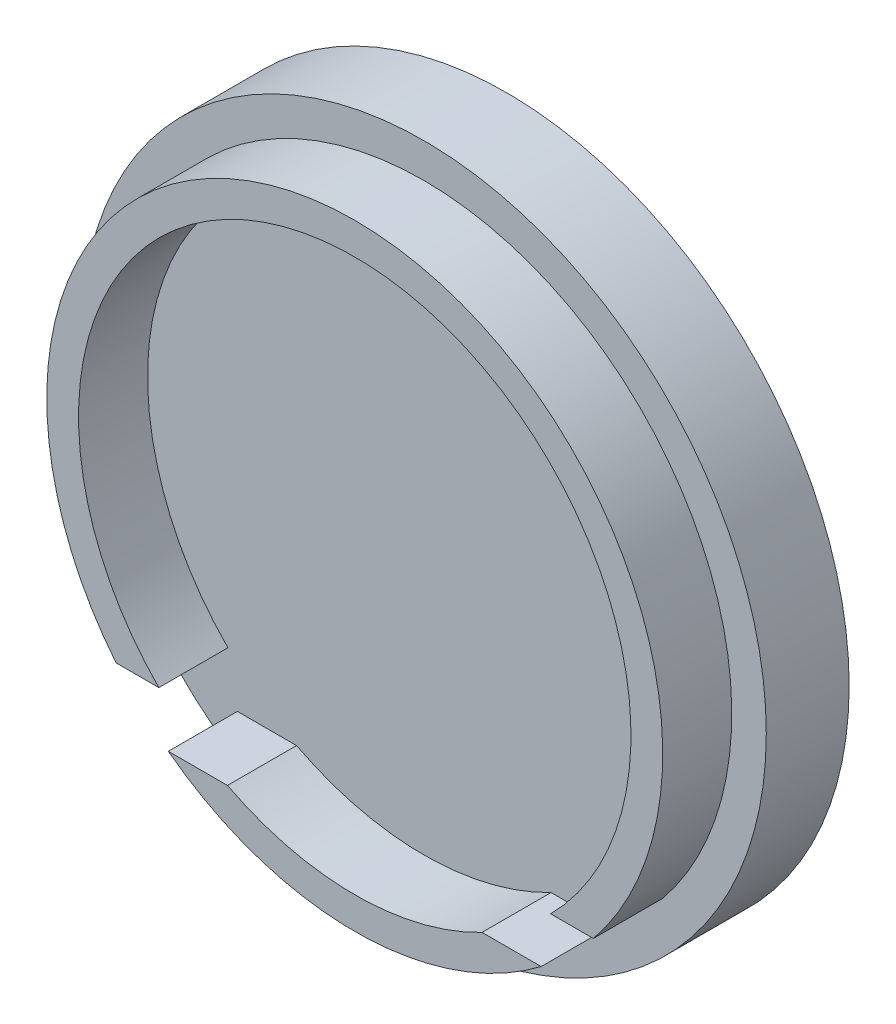
ISO-10303-21;
HEADER;
FILE_DESCRIPTION(('STEP AP214'),'2;1');
FILE_NAME('part.step','',(''),(''),'','','');
FILE_SCHEMA(('AUTOMOTIVE_DESIGN { 1 0 10303 214 1 1 1 1 }'));
ENDSEC;
DATA;
#1=APPLICATION_CONTEXT('core data for automotive mechanical design processes');
#2=APPLICATION_PROTOCOL_DEFINITION('international standard','automotive_design',2000,#1);
#3=PRODUCT_CONTEXT('',#1,'mechanical');
#4=PRODUCT('Part','Part','',(#3));
#5=PRODUCT_RELATED_PRODUCT_CATEGORY('part','',(#4));
#6=PRODUCT_DEFINITION_FORMATION('','',#4);
#7=PRODUCT_DEFINITION_CONTEXT('part definition',#1,'design');
#8=PRODUCT_DEFINITION('design','',#6,#7);
#9=PRODUCT_DEFINITION_SHAPE('','',#8);
#10=(LENGTH_UNIT() NAMED_UNIT(*) SI_UNIT(.MILLI.,.METRE.));
#11=(NAMED_UNIT(*) PLANE_ANGLE_UNIT() SI_UNIT($,.RADIAN.));
#12=(NAMED_UNIT(*) SI_UNIT($,.STERADIAN.) SOLID_ANGLE_UNIT());
#13=UNCERTAINTY_MEASURE_WITH_UNIT(LENGTH_MEASURE(1.E-05),#10,'distance_accuracy_value','');
#14=(GEOMETRIC_REPRESENTATION_CONTEXT(3) GLOBAL_UNCERTAINTY_ASSIGNED_CONTEXT((#13)) GLOBAL_UNIT_ASSIGNED_CONTEXT((#10,
#11,#12)) REPRESENTATION_CONTEXT('',''));
#15=CARTESIAN_POINT('',(0.,0.,0.));
#16=DIRECTION('',(0.,0.,1.));
#17=DIRECTION('',(1.,0.,0.));
#18=AXIS2_PLACEMENT_3D('',#15,#16,#17);
#19=CARTESIAN_POINT('',(0.,0.,11.));
#20=DIRECTION('',(0.,0.,1.));
#21=DIRECTION('',(1.,0.,0.));
#22=AXIS2_PLACEMENT_3D('',#19,#20,#21);
#23=PLANE('',#22);
#24=CARTESIAN_POINT('',(0.,0.,11.));
#25=DIRECTION('',(0.,0.,1.));
#26=DIRECTION('',(1.,0.,0.));
#27=AXIS2_PLACEMENT_3D('',#24,#25,#26);
#28=CIRCLE('',#27,20.);
#29=CARTESIAN_POINT('',(-9.21615429558338,-17.75,11.));
#30=VERTEX_POINT('',#29);
#31=CARTESIAN_POINT('',(9.21615429558338,-17.75,11.));
#32=VERTEX_POINT('',#31);
#33=EDGE_CURVE('E130',#30,#32,#28,.T.);
#34=ORIENTED_EDGE('',*,*,#33,.F.);
#35=DIRECTION('',(-1.,0.,0.));
#36=VECTOR('',#35,1.);
#37=CARTESIAN_POINT('',(0.,-17.75,11.));
#38=LINE('',#37,#36);
#39=CARTESIAN_POINT('',(-13.4991666409449,-17.75,11.));
#40=VERTEX_POINT('',#39);
#41=EDGE_CURVE('E145',#30,#40,#38,.T.);
#42=ORIENTED_EDGE('',*,*,#41,.T.);
#43=CARTESIAN_POINT('',(0.,0.,11.));
#44=DIRECTION('',(0.,0.,1.));
#45=DIRECTION('',(1.,0.,0.));
#46=AXIS2_PLACEMENT_3D('',#43,#44,#45);
#47=CIRCLE('',#46,22.3);
#48=CARTESIAN_POINT('',(13.4991666409449,-17.75,11.));
#49=VERTEX_POINT('',#48);
#50=EDGE_CURVE('E125',#40,#49,#47,.T.);
#51=ORIENTED_EDGE('',*,*,#50,.T.);
#52=DIRECTION('',(1.,0.,0.));
#53=VECTOR('',#52,1.);
#54=CARTESIAN_POINT('',(0.,-17.75,11.));
#55=LINE('',#54,#53);
#56=EDGE_CURVE('E150',#32,#49,#55,.T.);
#57=ORIENTED_EDGE('',*,*,#56,.F.);
#58=EDGE_LOOP('',(#34,#42,#51,#57));
#59=FACE_BOUND('',#58,.T.);
#60=ADVANCED_FACE('F33',(#59),#23,.T.);
#61=DIRECTION('',(-1.,0.,0.));
#62=VECTOR('',#61,1.);
#63=CARTESIAN_POINT('',(0.,-14.1,11.));
#64=LINE('',#63,#62);
#65=CARTESIAN_POINT('',(-14.184146079338,-14.1,11.));
#66=VERTEX_POINT('',#65);
#67=CARTESIAN_POINT('',(-17.2765737343954,-14.1,11.));
#68=VERTEX_POINT('',#67);
#69=EDGE_CURVE('E159',#66,#68,#64,.T.);
#70=ORIENTED_EDGE('',*,*,#69,.F.);
#71=CARTESIAN_POINT('',(14.184146079338,-14.1,11.));
#72=VERTEX_POINT('',#71);
#73=EDGE_CURVE('E115',#72,#66,#28,.T.);
#74=ORIENTED_EDGE('',*,*,#73,.F.);
#75=DIRECTION('',(1.,0.,0.));
#76=VECTOR('',#75,1.);
#77=CARTESIAN_POINT('',(0.,-14.1,11.));
#78=LINE('',#77,#76);
#79=CARTESIAN_POINT('',(17.2765737343954,-14.1,11.));
#80=VERTEX_POINT('',#79);
#81=EDGE_CURVE('E146',#72,#80,#78,.T.);
#82=ORIENTED_EDGE('',*,*,#81,.T.);
#83=EDGE_CURVE('E131',#80,#68,#47,.T.);
#84=ORIENTED_EDGE('',*,*,#83,.T.);
#85=EDGE_LOOP('',(#70,#74,#82,#84));
#86=FACE_BOUND('',#85,.T.);
#87=ADVANCED_FACE('F181',(#86),#23,.T.);
#88=CARTESIAN_POINT('',(0.,0.,11.));
#89=DIRECTION('',(0.,0.,-1.));
#90=DIRECTION('',(-1.,0.,0.));
#91=AXIS2_PLACEMENT_3D('',#88,#89,#90);
#92=CYLINDRICAL_SURFACE('',#91,22.3);
#93=DIRECTION('',(0.,0.,1.));
#94=VECTOR('',#93,1.);
#95=CARTESIAN_POINT('',(-13.4991666409449,-17.75,6.));
#96=LINE('',#95,#94);
#97=CARTESIAN_POINT('',(-13.4991666409449,-17.75,6.));
#98=VERTEX_POINT('',#97);
#99=EDGE_CURVE('E135',#98,#40,#96,.T.);
#100=ORIENTED_EDGE('',*,*,#99,.F.);
#101=CARTESIAN_POINT('',(0.,0.,6.));
#102=DIRECTION('',(0.,0.,1.));
#103=DIRECTION('',(1.,0.,0.));
#104=AXIS2_PLACEMENT_3D('',#101,#102,#103);
#105=CIRCLE('',#104,22.3);
#106=CARTESIAN_POINT('',(13.4991666409449,-17.75,6.));
#107=VERTEX_POINT('',#106);
#108=EDGE_CURVE('E129',#98,#107,#105,.T.);
#109=ORIENTED_EDGE('',*,*,#108,.T.);
#110=DIRECTION('',(0.,0.,1.));
#111=VECTOR('',#110,1.);
#112=CARTESIAN_POINT('',(13.4991666409449,-17.75,6.));
#113=LINE('',#112,#111);
#114=EDGE_CURVE('E138',#107,#49,#113,.T.);
#115=ORIENTED_EDGE('',*,*,#114,.T.);
#116=ORIENTED_EDGE('',*,*,#50,.F.);
#117=EDGE_LOOP('',(#100,#109,#115,#116));
#118=FACE_BOUND('',#117,.T.);
#119=ADVANCED_FACE('F169',(#118),#92,.T.);
#120=CARTESIAN_POINT('',(17.2765737343954,-14.1,6.));
#121=VERTEX_POINT('',#120);
#122=CARTESIAN_POINT('',(-17.2765737343954,-14.1,6.));
#123=VERTEX_POINT('',#122);
#124=EDGE_CURVE('E127',#121,#123,#105,.T.);
#125=ORIENTED_EDGE('',*,*,#124,.T.);
#126=DIRECTION('',(0.,0.,1.));
#127=VECTOR('',#126,1.);
#128=CARTESIAN_POINT('',(-17.2765737343954,-14.1,6.));
#129=LINE('',#128,#127);
#130=EDGE_CURVE('E105',#123,#68,#129,.T.);
#131=ORIENTED_EDGE('',*,*,#130,.T.);
#132=ORIENTED_EDGE('',*,*,#83,.F.);
#133=DIRECTION('',(0.,0.,1.));
#134=VECTOR('',#133,1.);
#135=CARTESIAN_POINT('',(17.2765737343954,-14.1,6.));
#136=LINE('',#135,#134);
#137=EDGE_CURVE('E141',#121,#80,#136,.T.);
#138=ORIENTED_EDGE('',*,*,#137,.F.);
#139=EDGE_LOOP('',(#125,#131,#132,#138));
#140=FACE_BOUND('',#139,.T.);
#141=ADVANCED_FACE('F193',(#140),#92,.T.);
#142=CARTESIAN_POINT('',(0.,0.,11.));
#143=DIRECTION('',(0.,0.,-1.));
#144=DIRECTION('',(-1.,0.,0.));
#145=AXIS2_PLACEMENT_3D('',#142,#143,#144);
#146=CYLINDRICAL_SURFACE('',#145,20.);
#147=CARTESIAN_POINT('',(0.,0.,6.));
#148=DIRECTION('',(0.,0.,1.));
#149=DIRECTION('',(1.,0.,0.));
#150=AXIS2_PLACEMENT_3D('',#147,#148,#149);
#151=CIRCLE('',#150,20.);
#152=CARTESIAN_POINT('',(9.21615429558338,-17.75,6.));
#153=VERTEX_POINT('',#152);
#154=CARTESIAN_POINT('',(-9.21615429558338,-17.75,6.));
#155=VERTEX_POINT('',#154);
#156=EDGE_CURVE('E11',#153,#155,#151,.F.);
#157=ORIENTED_EDGE('',*,*,#156,.T.);
#158=DIRECTION('',(0.,0.,1.));
#159=VECTOR('',#158,1.);
#160=CARTESIAN_POINT('',(-9.21615429558338,-17.75,6.));
#161=LINE('',#160,#159);
#162=EDGE_CURVE('E107',#155,#30,#161,.T.);
#163=ORIENTED_EDGE('',*,*,#162,.T.);
#164=ORIENTED_EDGE('',*,*,#33,.T.);
#165=DIRECTION('',(0.,0.,1.));
#166=VECTOR('',#165,1.);
#167=CARTESIAN_POINT('',(9.21615429558338,-17.75,6.));
#168=LINE('',#167,#166);
#169=EDGE_CURVE('E136',#153,#32,#168,.T.);
#170=ORIENTED_EDGE('',*,*,#169,.F.);
#171=EDGE_LOOP('',(#157,#163,#164,#170));
#172=FACE_BOUND('',#171,.T.);
#173=ADVANCED_FACE('F177',(#172),#146,.F.);
#174=DIRECTION('',(0.,0.,1.));
#175=VECTOR('',#174,1.);
#176=CARTESIAN_POINT('',(-14.184146079338,-14.1,6.));
#177=LINE('',#176,#175);
#178=CARTESIAN_POINT('',(-14.184146079338,-14.1,6.));
#179=VERTEX_POINT('',#178);
#180=EDGE_CURVE('E102',#179,#66,#177,.T.);
#181=ORIENTED_EDGE('',*,*,#180,.F.);
#182=CARTESIAN_POINT('',(14.184146079338,-14.1,6.));
#183=VERTEX_POINT('',#182);
#184=EDGE_CURVE('E37',#179,#183,#151,.F.);
#185=ORIENTED_EDGE('',*,*,#184,.T.);
#186=DIRECTION('',(0.,0.,1.));
#187=VECTOR('',#186,1.);
#188=CARTESIAN_POINT('',(14.184146079338,-14.1,6.));
#189=LINE('',#188,#187);
#190=EDGE_CURVE('E143',#183,#72,#189,.T.);
#191=ORIENTED_EDGE('',*,*,#190,.T.);
#192=ORIENTED_EDGE('',*,*,#73,.T.);
#193=EDGE_LOOP('',(#181,#185,#191,#192));
#194=FACE_BOUND('',#193,.T.);
#195=ADVANCED_FACE('F112',(#194),#146,.F.);
#196=CARTESIAN_POINT('',(0.,0.,6.));
#197=DIRECTION('',(0.,0.,-1.));
#198=DIRECTION('',(-1.,0.,0.));
#199=AXIS2_PLACEMENT_3D('',#196,#197,#198);
#200=CYLINDRICAL_SURFACE('',#199,24.8);
#201=CARTESIAN_POINT('',(0.,0.,6.));
#202=DIRECTION('',(0.,0.,1.));
#203=DIRECTION('',(1.,0.,0.));
#204=AXIS2_PLACEMENT_3D('',#201,#202,#203);
#205=CIRCLE('',#204,24.8);
#206=CARTESIAN_POINT('',(24.8,0.,6.));
#207=VERTEX_POINT('',#206);
#208=EDGE_CURVE('E119',#207,#207,#205,.T.);
#209=ORIENTED_EDGE('',*,*,#208,.F.);
#210=EDGE_LOOP('',(#209));
#211=FACE_BOUND('',#210,.T.);
#212=CARTESIAN_POINT('',(0.,0.,0.));
#213=DIRECTION('',(0.,0.,1.));
#214=DIRECTION('',(1.,0.,0.));
#215=AXIS2_PLACEMENT_3D('',#212,#213,#214);
#216=CIRCLE('',#215,24.8);
#217=CARTESIAN_POINT('',(24.8,0.,0.));
#218=VERTEX_POINT('',#217);
#219=EDGE_CURVE('E121',#218,#218,#216,.T.);
#220=ORIENTED_EDGE('',*,*,#219,.T.);
#221=EDGE_LOOP('',(#220));
#222=FACE_BOUND('',#221,.T.);
#223=ADVANCED_FACE('F35',(#211,#222),#200,.T.);
#224=CARTESIAN_POINT('',(0.,0.,6.));
#225=DIRECTION('',(0.,0.,1.));
#226=DIRECTION('',(1.,0.,0.));
#227=AXIS2_PLACEMENT_3D('',#224,#225,#226);
#228=PLANE('',#227);
#229=ORIENTED_EDGE('',*,*,#108,.F.);
#230=DIRECTION('',(-1.,0.,0.));
#231=VECTOR('',#230,1.);
#232=CARTESIAN_POINT('',(0.,-17.75,6.));
#233=LINE('',#232,#231);
#234=EDGE_CURVE('E48',#155,#98,#233,.T.);
#235=ORIENTED_EDGE('',*,*,#234,.F.);
#236=ORIENTED_EDGE('',*,*,#156,.F.);
#237=DIRECTION('',(1.,0.,0.));
#238=VECTOR('',#237,1.);
#239=CARTESIAN_POINT('',(0.,-17.75,6.));
#240=LINE('',#239,#238);
#241=EDGE_CURVE('E149',#153,#107,#240,.T.);
#242=ORIENTED_EDGE('',*,*,#241,.T.);
#243=EDGE_LOOP('',(#229,#235,#236,#242));
#244=FACE_BOUND('',#243,.T.);
#245=DIRECTION('',(-1.,0.,0.));
#246=VECTOR('',#245,1.);
#247=CARTESIAN_POINT('',(0.,-14.1,6.));
#248=LINE('',#247,#246);
#249=EDGE_CURVE('E99',#179,#123,#248,.T.);
#250=ORIENTED_EDGE('',*,*,#249,.T.);
#251=ORIENTED_EDGE('',*,*,#124,.F.);
#252=DIRECTION('',(1.,0.,0.));
#253=VECTOR('',#252,1.);
#254=CARTESIAN_POINT('',(0.,-14.1,6.));
#255=LINE('',#254,#253);
#256=EDGE_CURVE('E56',#183,#121,#255,.T.);
#257=ORIENTED_EDGE('',*,*,#256,.F.);
#258=ORIENTED_EDGE('',*,*,#184,.F.);
#259=EDGE_LOOP('',(#250,#251,#257,#258));
#260=FACE_BOUND('',#259,.T.);
#261=ORIENTED_EDGE('',*,*,#208,.T.);
#262=EDGE_LOOP('',(#261));
#263=FACE_BOUND('',#262,.T.);
#264=ADVANCED_FACE('F117',(#244,#260,#263),#228,.T.);
#265=CARTESIAN_POINT('',(0.,0.,0.));
#266=DIRECTION('',(0.,0.,1.));
#267=DIRECTION('',(1.,0.,0.));
#268=AXIS2_PLACEMENT_3D('',#265,#266,#267);
#269=PLANE('',#268);
#270=ORIENTED_EDGE('',*,*,#219,.F.);
#271=EDGE_LOOP('',(#270));
#272=FACE_BOUND('',#271,.T.);
#273=ADVANCED_FACE('F195',(#272),#269,.F.);
#274=CARTESIAN_POINT('',(0.,-14.1,6.));
#275=DIRECTION('',(0.,-1.,0.));
#276=DIRECTION('',(0.,0.,-1.));
#277=AXIS2_PLACEMENT_3D('',#274,#275,#276);
#278=PLANE('',#277);
#279=ORIENTED_EDGE('',*,*,#81,.F.);
#280=ORIENTED_EDGE('',*,*,#190,.F.);
#281=ORIENTED_EDGE('',*,*,#256,.T.);
#282=ORIENTED_EDGE('',*,*,#137,.T.);
#283=EDGE_LOOP('',(#279,#280,#281,#282));
#284=FACE_BOUND('',#283,.T.);
#285=ADVANCED_FACE('F197',(#284),#278,.T.);
#286=CARTESIAN_POINT('',(0.,-17.75,6.));
#287=DIRECTION('',(0.,-1.,0.));
#288=DIRECTION('',(0.,0.,-1.));
#289=AXIS2_PLACEMENT_3D('',#286,#287,#288);
#290=PLANE('',#289);
#291=ORIENTED_EDGE('',*,*,#56,.T.);
#292=ORIENTED_EDGE('',*,*,#114,.F.);
#293=ORIENTED_EDGE('',*,*,#241,.F.);
#294=ORIENTED_EDGE('',*,*,#169,.T.);
#295=EDGE_LOOP('',(#291,#292,#293,#294));
#296=FACE_BOUND('',#295,.T.);
#297=ADVANCED_FACE('F173',(#296),#290,.F.);
#298=CARTESIAN_POINT('',(0.,-17.75,6.));
#299=DIRECTION('',(0.,1.,0.));
#300=DIRECTION('',(0.,0.,1.));
#301=AXIS2_PLACEMENT_3D('',#298,#299,#300);
#302=PLANE('',#301);
#303=ORIENTED_EDGE('',*,*,#41,.F.);
#304=ORIENTED_EDGE('',*,*,#162,.F.);
#305=ORIENTED_EDGE('',*,*,#234,.T.);
#306=ORIENTED_EDGE('',*,*,#99,.T.);
#307=EDGE_LOOP('',(#303,#304,#305,#306));
#308=FACE_BOUND('',#307,.T.);
#309=ADVANCED_FACE('F165',(#308),#302,.T.);
#310=CARTESIAN_POINT('',(0.,-14.1,6.));
#311=DIRECTION('',(0.,1.,0.));
#312=DIRECTION('',(0.,0.,1.));
#313=AXIS2_PLACEMENT_3D('',#310,#311,#312);
#314=PLANE('',#313);
#315=ORIENTED_EDGE('',*,*,#69,.T.);
#316=ORIENTED_EDGE('',*,*,#130,.F.);
#317=ORIENTED_EDGE('',*,*,#249,.F.);
#318=ORIENTED_EDGE('',*,*,#180,.T.);
#319=EDGE_LOOP('',(#315,#316,#317,#318));
#320=FACE_BOUND('',#319,.T.);
#321=ADVANCED_FACE('F101',(#320),#314,.F.);
#322=CLOSED_SHELL('',(#60,#87,#119,#141,#173,#195,#223,#264,#273,#285,#297,#309,#321));
#323=MANIFOLD_SOLID_BREP('B2',#322);
#324=ADVANCED_BREP_SHAPE_REPRESENTATION('',(#18,#323),#14);
#325=SHAPE_DEFINITION_REPRESENTATION(#9,#324);
ENDSEC;
END-ISO-10303-21;
